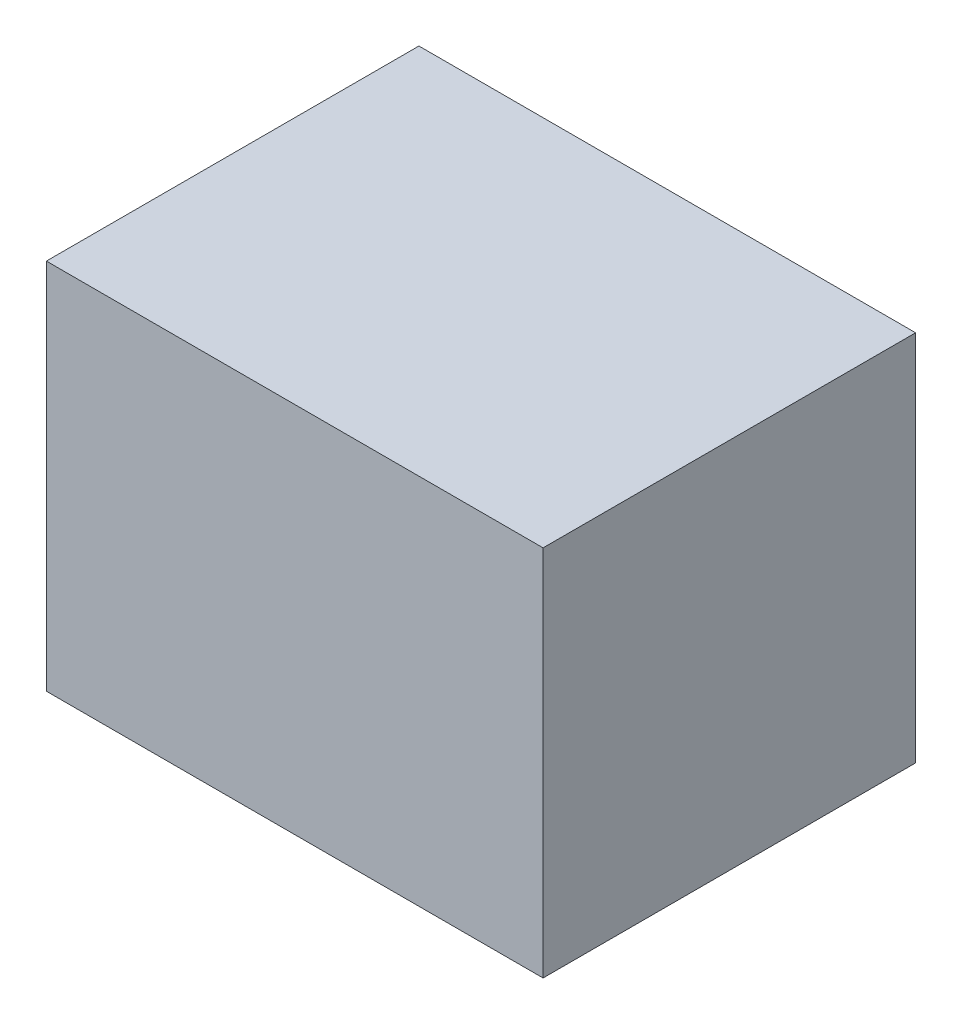
ISO-10303-21;
HEADER;
FILE_DESCRIPTION(('STEP AP214'),'2;1');
FILE_NAME('part.step','',(''),(''),'','','');
FILE_SCHEMA(('AUTOMOTIVE_DESIGN { 1 0 10303 214 1 1 1 1 }'));
ENDSEC;
DATA;
#1=APPLICATION_CONTEXT('core data for automotive mechanical design processes');
#2=APPLICATION_PROTOCOL_DEFINITION('international standard','automotive_design',2000,#1);
#3=PRODUCT_CONTEXT('',#1,'mechanical');
#4=PRODUCT('Part','Part','',(#3));
#5=PRODUCT_RELATED_PRODUCT_CATEGORY('part','',(#4));
#6=PRODUCT_DEFINITION_FORMATION('','',#4);
#7=PRODUCT_DEFINITION_CONTEXT('part definition',#1,'design');
#8=PRODUCT_DEFINITION('design','',#6,#7);
#9=PRODUCT_DEFINITION_SHAPE('','',#8);
#10=(LENGTH_UNIT() NAMED_UNIT(*) SI_UNIT(.MILLI.,.METRE.));
#11=(NAMED_UNIT(*) PLANE_ANGLE_UNIT() SI_UNIT($,.RADIAN.));
#12=(NAMED_UNIT(*) SI_UNIT($,.STERADIAN.) SOLID_ANGLE_UNIT());
#13=UNCERTAINTY_MEASURE_WITH_UNIT(LENGTH_MEASURE(1.E-05),#10,'distance_accuracy_value','');
#14=(GEOMETRIC_REPRESENTATION_CONTEXT(3) GLOBAL_UNCERTAINTY_ASSIGNED_CONTEXT((#13)) GLOBAL_UNIT_ASSIGNED_CONTEXT((#10,
#11,#12)) REPRESENTATION_CONTEXT('',''));
#15=CARTESIAN_POINT('',(0.,0.,0.));
#16=DIRECTION('',(0.,0.,1.));
#17=DIRECTION('',(1.,0.,0.));
#18=AXIS2_PLACEMENT_3D('',#15,#16,#17);
#19=CARTESIAN_POINT('',(0.,0.,300.));
#20=DIRECTION('',(1.,0.,0.));
#21=DIRECTION('',(0.,0.,-1.));
#22=AXIS2_PLACEMENT_3D('',#19,#20,#21);
#23=PLANE('',#22);
#24=DIRECTION('',(0.,-1.,0.));
#25=VECTOR('',#24,1.);
#26=CARTESIAN_POINT('',(0.,0.,0.));
#27=LINE('',#26,#25);
#28=CARTESIAN_POINT('',(0.,300.,0.));
#29=VERTEX_POINT('',#28);
#30=CARTESIAN_POINT('',(0.,0.,0.));
#31=VERTEX_POINT('',#30);
#32=EDGE_CURVE('E150',#29,#31,#27,.T.);
#33=ORIENTED_EDGE('',*,*,#32,.T.);
#34=DIRECTION('',(0.,0.,-1.));
#35=VECTOR('',#34,1.);
#36=CARTESIAN_POINT('',(0.,0.,300.));
#37=LINE('',#36,#35);
#38=CARTESIAN_POINT('',(0.,0.,300.));
#39=VERTEX_POINT('',#38);
#40=EDGE_CURVE('E139',#39,#31,#37,.T.);
#41=ORIENTED_EDGE('',*,*,#40,.F.);
#42=DIRECTION('',(0.,-1.,0.));
#43=VECTOR('',#42,1.);
#44=CARTESIAN_POINT('',(0.,0.,300.));
#45=LINE('',#44,#43);
#46=CARTESIAN_POINT('',(0.,300.,300.));
#47=VERTEX_POINT('',#46);
#48=EDGE_CURVE('E131',#47,#39,#45,.T.);
#49=ORIENTED_EDGE('',*,*,#48,.F.);
#50=DIRECTION('',(0.,0.,-1.));
#51=VECTOR('',#50,1.);
#52=CARTESIAN_POINT('',(0.,300.,300.));
#53=LINE('',#52,#51);
#54=EDGE_CURVE('E146',#47,#29,#53,.T.);
#55=ORIENTED_EDGE('',*,*,#54,.T.);
#56=EDGE_LOOP('',(#33,#41,#49,#55));
#57=FACE_BOUND('',#56,.T.);
#58=ADVANCED_FACE('F39',(#57),#23,.F.);
#59=CARTESIAN_POINT('',(0.,0.,300.));
#60=DIRECTION('',(0.,1.,0.));
#61=DIRECTION('',(0.,0.,1.));
#62=AXIS2_PLACEMENT_3D('',#59,#60,#61);
#63=PLANE('',#62);
#64=DIRECTION('',(1.,0.,0.));
#65=VECTOR('',#64,1.);
#66=CARTESIAN_POINT('',(0.,0.,0.));
#67=LINE('',#66,#65);
#68=CARTESIAN_POINT('',(400.,0.,0.));
#69=VERTEX_POINT('',#68);
#70=EDGE_CURVE('E137',#31,#69,#67,.T.);
#71=ORIENTED_EDGE('',*,*,#70,.T.);
#72=DIRECTION('',(0.,0.,-1.));
#73=VECTOR('',#72,1.);
#74=CARTESIAN_POINT('',(400.,0.,300.));
#75=LINE('',#74,#73);
#76=CARTESIAN_POINT('',(400.,0.,300.));
#77=VERTEX_POINT('',#76);
#78=EDGE_CURVE('E135',#77,#69,#75,.T.);
#79=ORIENTED_EDGE('',*,*,#78,.F.);
#80=DIRECTION('',(1.,0.,0.));
#81=VECTOR('',#80,1.);
#82=CARTESIAN_POINT('',(0.,0.,300.));
#83=LINE('',#82,#81);
#84=EDGE_CURVE('E126',#39,#77,#83,.T.);
#85=ORIENTED_EDGE('',*,*,#84,.F.);
#86=ORIENTED_EDGE('',*,*,#40,.T.);
#87=EDGE_LOOP('',(#71,#79,#85,#86));
#88=FACE_BOUND('',#87,.T.);
#89=ADVANCED_FACE('F136',(#88),#63,.F.);
#90=CARTESIAN_POINT('',(400.,0.,300.));
#91=DIRECTION('',(-1.,0.,0.));
#92=DIRECTION('',(0.,0.,1.));
#93=AXIS2_PLACEMENT_3D('',#90,#91,#92);
#94=PLANE('',#93);
#95=DIRECTION('',(0.,1.,0.));
#96=VECTOR('',#95,1.);
#97=CARTESIAN_POINT('',(400.,0.,0.));
#98=LINE('',#97,#96);
#99=CARTESIAN_POINT('',(400.,300.,0.));
#100=VERTEX_POINT('',#99);
#101=EDGE_CURVE('E112',#69,#100,#98,.T.);
#102=ORIENTED_EDGE('',*,*,#101,.T.);
#103=DIRECTION('',(0.,0.,-1.));
#104=VECTOR('',#103,1.);
#105=CARTESIAN_POINT('',(400.,300.,300.));
#106=LINE('',#105,#104);
#107=CARTESIAN_POINT('',(400.,300.,300.));
#108=VERTEX_POINT('',#107);
#109=EDGE_CURVE('E140',#108,#100,#106,.T.);
#110=ORIENTED_EDGE('',*,*,#109,.F.);
#111=DIRECTION('',(0.,1.,0.));
#112=VECTOR('',#111,1.);
#113=CARTESIAN_POINT('',(400.,0.,300.));
#114=LINE('',#113,#112);
#115=EDGE_CURVE('E129',#77,#108,#114,.T.);
#116=ORIENTED_EDGE('',*,*,#115,.F.);
#117=ORIENTED_EDGE('',*,*,#78,.T.);
#118=EDGE_LOOP('',(#102,#110,#116,#117));
#119=FACE_BOUND('',#118,.T.);
#120=ADVANCED_FACE('F142',(#119),#94,.F.);
#121=CARTESIAN_POINT('',(0.,300.,300.));
#122=DIRECTION('',(0.,-1.,0.));
#123=DIRECTION('',(0.,0.,-1.));
#124=AXIS2_PLACEMENT_3D('',#121,#122,#123);
#125=PLANE('',#124);
#126=DIRECTION('',(-1.,0.,0.));
#127=VECTOR('',#126,1.);
#128=CARTESIAN_POINT('',(0.,300.,0.));
#129=LINE('',#128,#127);
#130=EDGE_CURVE('E118',#100,#29,#129,.T.);
#131=ORIENTED_EDGE('',*,*,#130,.T.);
#132=ORIENTED_EDGE('',*,*,#54,.F.);
#133=DIRECTION('',(-1.,0.,0.));
#134=VECTOR('',#133,1.);
#135=CARTESIAN_POINT('',(0.,300.,300.));
#136=LINE('',#135,#134);
#137=EDGE_CURVE('E95',#108,#47,#136,.T.);
#138=ORIENTED_EDGE('',*,*,#137,.F.);
#139=ORIENTED_EDGE('',*,*,#109,.T.);
#140=EDGE_LOOP('',(#131,#132,#138,#139));
#141=FACE_BOUND('',#140,.T.);
#142=ADVANCED_FACE('F232',(#141),#125,.F.);
#143=CARTESIAN_POINT('',(0.,0.,300.));
#144=DIRECTION('',(0.,0.,-1.));
#145=DIRECTION('',(-1.,0.,0.));
#146=AXIS2_PLACEMENT_3D('',#143,#144,#145);
#147=PLANE('',#146);
#148=ORIENTED_EDGE('',*,*,#48,.T.);
#149=ORIENTED_EDGE('',*,*,#84,.T.);
#150=ORIENTED_EDGE('',*,*,#115,.T.);
#151=ORIENTED_EDGE('',*,*,#137,.T.);
#152=EDGE_LOOP('',(#148,#149,#150,#151));
#153=FACE_BOUND('',#152,.T.);
#154=ADVANCED_FACE('F127',(#153),#147,.F.);
#155=CARTESIAN_POINT('',(0.,0.,0.));
#156=DIRECTION('',(0.,0.,-1.));
#157=DIRECTION('',(-1.,0.,0.));
#158=AXIS2_PLACEMENT_3D('',#155,#156,#157);
#159=PLANE('',#158);
#160=ORIENTED_EDGE('',*,*,#32,.F.);
#161=ORIENTED_EDGE('',*,*,#130,.F.);
#162=ORIENTED_EDGE('',*,*,#101,.F.);
#163=ORIENTED_EDGE('',*,*,#70,.F.);
#164=EDGE_LOOP('',(#160,#161,#162,#163));
#165=FACE_BOUND('',#164,.T.);
#166=ADVANCED_FACE('F235',(#165),#159,.T.);
#167=CLOSED_SHELL('',(#58,#89,#120,#142,#154,#166));
#168=CARTESIAN_POINT('',(15.,0.,300.));
#169=DIRECTION('',(1.,0.,0.));
#170=DIRECTION('',(0.,0.,-1.));
#171=AXIS2_PLACEMENT_3D('',#168,#169,#170);
#172=PLANE('',#171);
#173=DIRECTION('',(0.,-1.,0.));
#174=VECTOR('',#173,1.);
#175=CARTESIAN_POINT('',(15.,0.,15.));
#176=LINE('',#175,#174);
#177=CARTESIAN_POINT('',(15.,285.,15.));
#178=VERTEX_POINT('',#177);
#179=CARTESIAN_POINT('',(15.,15.,15.));
#180=VERTEX_POINT('',#179);
#181=EDGE_CURVE('E43',#178,#180,#176,.T.);
#182=ORIENTED_EDGE('',*,*,#181,.F.);
#183=DIRECTION('',(0.,0.,-1.));
#184=VECTOR('',#183,1.);
#185=CARTESIAN_POINT('',(15.,285.,300.));
#186=LINE('',#185,#184);
#187=CARTESIAN_POINT('',(15.,285.,285.));
#188=VERTEX_POINT('',#187);
#189=EDGE_CURVE('E190',#188,#178,#186,.T.);
#190=ORIENTED_EDGE('',*,*,#189,.F.);
#191=DIRECTION('',(0.,-1.,0.));
#192=VECTOR('',#191,1.);
#193=CARTESIAN_POINT('',(15.,0.,285.));
#194=LINE('',#193,#192);
#195=CARTESIAN_POINT('',(15.,15.,285.));
#196=VERTEX_POINT('',#195);
#197=EDGE_CURVE('E170',#188,#196,#194,.T.);
#198=ORIENTED_EDGE('',*,*,#197,.T.);
#199=DIRECTION('',(0.,0.,-1.));
#200=VECTOR('',#199,1.);
#201=CARTESIAN_POINT('',(15.,15.,300.));
#202=LINE('',#201,#200);
#203=EDGE_CURVE('E186',#196,#180,#202,.T.);
#204=ORIENTED_EDGE('',*,*,#203,.T.);
#205=EDGE_LOOP('',(#182,#190,#198,#204));
#206=FACE_BOUND('',#205,.T.);
#207=ADVANCED_FACE('F199',(#206),#172,.T.);
#208=CARTESIAN_POINT('',(0.,15.,300.));
#209=DIRECTION('',(0.,1.,0.));
#210=DIRECTION('',(0.,0.,1.));
#211=AXIS2_PLACEMENT_3D('',#208,#209,#210);
#212=PLANE('',#211);
#213=DIRECTION('',(1.,0.,0.));
#214=VECTOR('',#213,1.);
#215=CARTESIAN_POINT('',(0.,15.,15.));
#216=LINE('',#215,#214);
#217=CARTESIAN_POINT('',(385.,15.,15.));
#218=VERTEX_POINT('',#217);
#219=EDGE_CURVE('E60',#180,#218,#216,.T.);
#220=ORIENTED_EDGE('',*,*,#219,.F.);
#221=ORIENTED_EDGE('',*,*,#203,.F.);
#222=DIRECTION('',(1.,0.,0.));
#223=VECTOR('',#222,1.);
#224=CARTESIAN_POINT('',(0.,15.,285.));
#225=LINE('',#224,#223);
#226=CARTESIAN_POINT('',(385.,15.,285.));
#227=VERTEX_POINT('',#226);
#228=EDGE_CURVE('E83',#196,#227,#225,.T.);
#229=ORIENTED_EDGE('',*,*,#228,.T.);
#230=DIRECTION('',(0.,0.,-1.));
#231=VECTOR('',#230,1.);
#232=CARTESIAN_POINT('',(385.,15.,300.));
#233=LINE('',#232,#231);
#234=EDGE_CURVE('E180',#227,#218,#233,.T.);
#235=ORIENTED_EDGE('',*,*,#234,.T.);
#236=EDGE_LOOP('',(#220,#221,#229,#235));
#237=FACE_BOUND('',#236,.T.);
#238=ADVANCED_FACE('F200',(#237),#212,.T.);
#239=CARTESIAN_POINT('',(385.,0.,300.));
#240=DIRECTION('',(-1.,0.,0.));
#241=DIRECTION('',(0.,0.,1.));
#242=AXIS2_PLACEMENT_3D('',#239,#240,#241);
#243=PLANE('',#242);
#244=DIRECTION('',(0.,1.,0.));
#245=VECTOR('',#244,1.);
#246=CARTESIAN_POINT('',(385.,0.,15.));
#247=LINE('',#246,#245);
#248=CARTESIAN_POINT('',(385.,285.,15.));
#249=VERTEX_POINT('',#248);
#250=EDGE_CURVE('E183',#218,#249,#247,.T.);
#251=ORIENTED_EDGE('',*,*,#250,.F.);
#252=ORIENTED_EDGE('',*,*,#234,.F.);
#253=DIRECTION('',(0.,1.,0.));
#254=VECTOR('',#253,1.);
#255=CARTESIAN_POINT('',(385.,0.,285.));
#256=LINE('',#255,#254);
#257=CARTESIAN_POINT('',(385.,285.,285.));
#258=VERTEX_POINT('',#257);
#259=EDGE_CURVE('E51',#227,#258,#256,.T.);
#260=ORIENTED_EDGE('',*,*,#259,.T.);
#261=DIRECTION('',(0.,0.,-1.));
#262=VECTOR('',#261,1.);
#263=CARTESIAN_POINT('',(385.,285.,300.));
#264=LINE('',#263,#262);
#265=EDGE_CURVE('E173',#258,#249,#264,.T.);
#266=ORIENTED_EDGE('',*,*,#265,.T.);
#267=EDGE_LOOP('',(#251,#252,#260,#266));
#268=FACE_BOUND('',#267,.T.);
#269=ADVANCED_FACE('F204',(#268),#243,.T.);
#270=CARTESIAN_POINT('',(0.,285.,300.));
#271=DIRECTION('',(0.,-1.,0.));
#272=DIRECTION('',(0.,0.,-1.));
#273=AXIS2_PLACEMENT_3D('',#270,#271,#272);
#274=PLANE('',#273);
#275=DIRECTION('',(-1.,0.,0.));
#276=VECTOR('',#275,1.);
#277=CARTESIAN_POINT('',(0.,285.,15.));
#278=LINE('',#277,#276);
#279=EDGE_CURVE('E177',#249,#178,#278,.T.);
#280=ORIENTED_EDGE('',*,*,#279,.F.);
#281=ORIENTED_EDGE('',*,*,#265,.F.);
#282=DIRECTION('',(-1.,0.,0.));
#283=VECTOR('',#282,1.);
#284=CARTESIAN_POINT('',(0.,285.,285.));
#285=LINE('',#284,#283);
#286=EDGE_CURVE('E11',#258,#188,#285,.T.);
#287=ORIENTED_EDGE('',*,*,#286,.T.);
#288=ORIENTED_EDGE('',*,*,#189,.T.);
#289=EDGE_LOOP('',(#280,#281,#287,#288));
#290=FACE_BOUND('',#289,.T.);
#291=ADVANCED_FACE('F208',(#290),#274,.T.);
#292=CARTESIAN_POINT('',(0.,0.,285.));
#293=DIRECTION('',(0.,0.,-1.));
#294=DIRECTION('',(-1.,0.,0.));
#295=AXIS2_PLACEMENT_3D('',#292,#293,#294);
#296=PLANE('',#295);
#297=ORIENTED_EDGE('',*,*,#197,.F.);
#298=ORIENTED_EDGE('',*,*,#286,.F.);
#299=ORIENTED_EDGE('',*,*,#259,.F.);
#300=ORIENTED_EDGE('',*,*,#228,.F.);
#301=EDGE_LOOP('',(#297,#298,#299,#300));
#302=FACE_BOUND('',#301,.T.);
#303=ADVANCED_FACE('F207',(#302),#296,.T.);
#304=CARTESIAN_POINT('',(0.,0.,15.));
#305=DIRECTION('',(0.,0.,-1.));
#306=DIRECTION('',(-1.,0.,0.));
#307=AXIS2_PLACEMENT_3D('',#304,#305,#306);
#308=PLANE('',#307);
#309=ORIENTED_EDGE('',*,*,#181,.T.);
#310=ORIENTED_EDGE('',*,*,#219,.T.);
#311=ORIENTED_EDGE('',*,*,#250,.T.);
#312=ORIENTED_EDGE('',*,*,#279,.T.);
#313=EDGE_LOOP('',(#309,#310,#311,#312));
#314=FACE_BOUND('',#313,.T.);
#315=ADVANCED_FACE('F41',(#314),#308,.F.);
#316=CLOSED_SHELL('',(#207,#238,#269,#291,#303,#315));
#317=ORIENTED_CLOSED_SHELL('',*,#316,.T.);
#318=BREP_WITH_VOIDS('B2',#167,(#317));
#319=ADVANCED_BREP_SHAPE_REPRESENTATION('',(#18,#318),#14);
#320=SHAPE_DEFINITION_REPRESENTATION(#9,#319);
ENDSEC;
END-ISO-10303-21;
